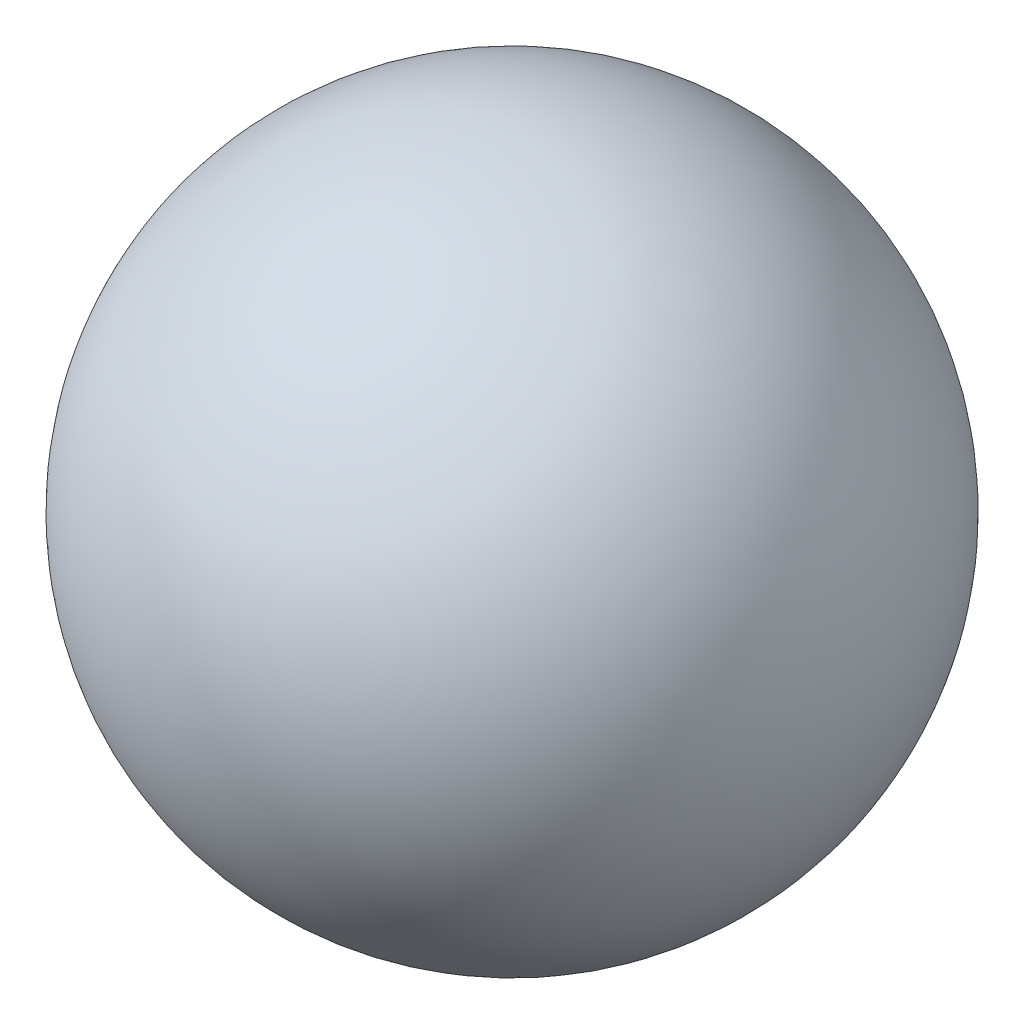
ISO-10303-21;
HEADER;
FILE_DESCRIPTION(('STEP AP214'),'2;1');
FILE_NAME('part.step','',(''),(''),'','','');
FILE_SCHEMA(('AUTOMOTIVE_DESIGN { 1 0 10303 214 1 1 1 1 }'));
ENDSEC;
DATA;
#1=APPLICATION_CONTEXT('core data for automotive mechanical design processes');
#2=APPLICATION_PROTOCOL_DEFINITION('international standard','automotive_design',2000,#1);
#3=PRODUCT_CONTEXT('',#1,'mechanical');
#4=PRODUCT('Part','Part','',(#3));
#5=PRODUCT_RELATED_PRODUCT_CATEGORY('part','',(#4));
#6=PRODUCT_DEFINITION_FORMATION('','',#4);
#7=PRODUCT_DEFINITION_CONTEXT('part definition',#1,'design');
#8=PRODUCT_DEFINITION('design','',#6,#7);
#9=PRODUCT_DEFINITION_SHAPE('','',#8);
#10=(LENGTH_UNIT() NAMED_UNIT(*) SI_UNIT(.MILLI.,.METRE.));
#11=(NAMED_UNIT(*) PLANE_ANGLE_UNIT() SI_UNIT($,.RADIAN.));
#12=(NAMED_UNIT(*) SI_UNIT($,.STERADIAN.) SOLID_ANGLE_UNIT());
#13=UNCERTAINTY_MEASURE_WITH_UNIT(LENGTH_MEASURE(1.E-05),#10,'distance_accuracy_value','');
#14=(GEOMETRIC_REPRESENTATION_CONTEXT(3) GLOBAL_UNCERTAINTY_ASSIGNED_CONTEXT((#13)) GLOBAL_UNIT_ASSIGNED_CONTEXT((#10,
#11,#12)) REPRESENTATION_CONTEXT('',''));
#15=CARTESIAN_POINT('',(0.,0.,0.));
#16=DIRECTION('',(0.,0.,1.));
#17=DIRECTION('',(1.,0.,0.));
#18=AXIS2_PLACEMENT_3D('',#15,#16,#17);
#19=CARTESIAN_POINT('',(0.,0.1778,0.));
#20=DIRECTION('',(1.,0.,0.));
#21=DIRECTION('',(0.,-1.,0.));
#22=AXIS2_PLACEMENT_3D('',#19,#20,#21);
#23=SPHERICAL_SURFACE('',#22,2.5908);
#24=CARTESIAN_POINT('',(2.5908,0.1778,0.));
#25=VERTEX_POINT('',#24);
#26=VERTEX_LOOP('',#25);
#27=FACE_BOUND('',#26,.T.);
#28=ADVANCED_FACE('F28',(#27),#23,.T.);
#29=CLOSED_SHELL('',(#28));
#30=MANIFOLD_SOLID_BREP('B2',#29);
#31=ADVANCED_BREP_SHAPE_REPRESENTATION('',(#18,#30),#14);
#32=SHAPE_DEFINITION_REPRESENTATION(#9,#31);
ENDSEC;
END-ISO-10303-21;
